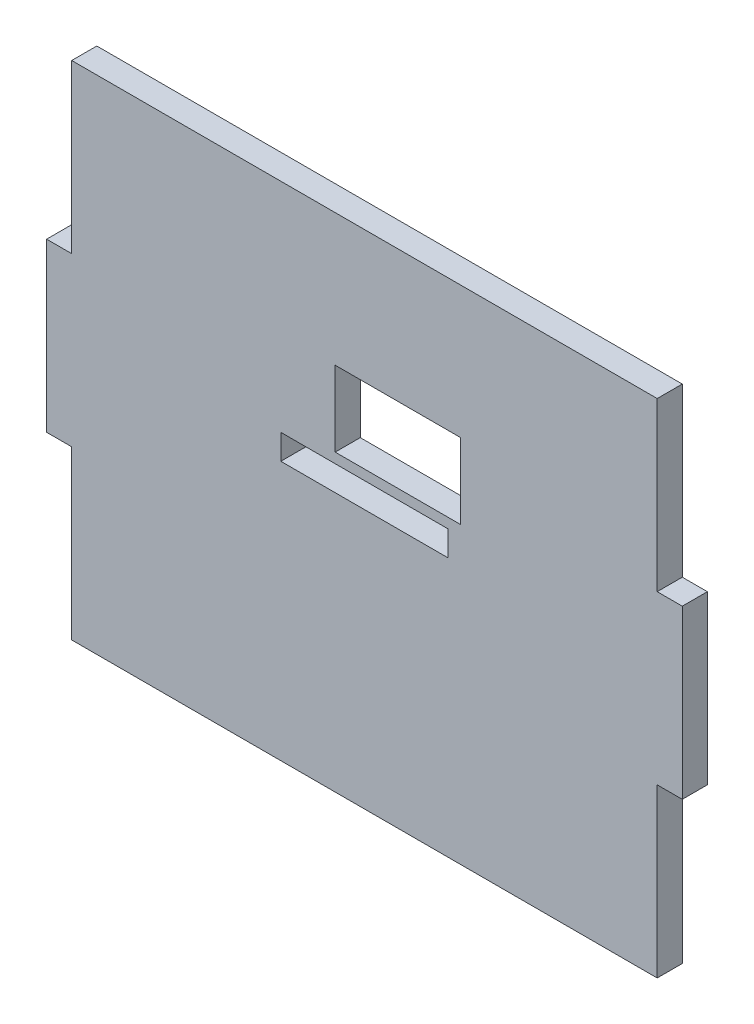
ISO-10303-21;
HEADER;
FILE_DESCRIPTION(('STEP AP214'),'2;1');
FILE_NAME('part.step','',(''),(''),'','','');
FILE_SCHEMA(('AUTOMOTIVE_DESIGN { 1 0 10303 214 1 1 1 1 }'));
ENDSEC;
DATA;
#1=APPLICATION_CONTEXT('core data for automotive mechanical design processes');
#2=APPLICATION_PROTOCOL_DEFINITION('international standard','automotive_design',2000,#1);
#3=PRODUCT_CONTEXT('',#1,'mechanical');
#4=PRODUCT('Part','Part','',(#3));
#5=PRODUCT_RELATED_PRODUCT_CATEGORY('part','',(#4));
#6=PRODUCT_DEFINITION_FORMATION('','',#4);
#7=PRODUCT_DEFINITION_CONTEXT('part definition',#1,'design');
#8=PRODUCT_DEFINITION('design','',#6,#7);
#9=PRODUCT_DEFINITION_SHAPE('','',#8);
#10=(LENGTH_UNIT() NAMED_UNIT(*) SI_UNIT(.MILLI.,.METRE.));
#11=(NAMED_UNIT(*) PLANE_ANGLE_UNIT() SI_UNIT($,.RADIAN.));
#12=(NAMED_UNIT(*) SI_UNIT($,.STERADIAN.) SOLID_ANGLE_UNIT());
#13=UNCERTAINTY_MEASURE_WITH_UNIT(LENGTH_MEASURE(1.E-05),#10,'distance_accuracy_value','');
#14=(GEOMETRIC_REPRESENTATION_CONTEXT(3) GLOBAL_UNCERTAINTY_ASSIGNED_CONTEXT((#13)) GLOBAL_UNIT_ASSIGNED_CONTEXT((#10,
#11,#12)) REPRESENTATION_CONTEXT('',''));
#15=CARTESIAN_POINT('',(0.,0.,0.));
#16=DIRECTION('',(0.,0.,1.));
#17=DIRECTION('',(1.,0.,0.));
#18=AXIS2_PLACEMENT_3D('',#15,#16,#17);
#19=CARTESIAN_POINT('',(-35.,30.,3.));
#20=DIRECTION('',(1.,0.,0.));
#21=DIRECTION('',(0.,1.,0.));
#22=AXIS2_PLACEMENT_3D('',#19,#20,#21);
#23=PLANE('',#22);
#24=DIRECTION('',(0.,0.,1.));
#25=VECTOR('',#24,1.);
#26=CARTESIAN_POINT('',(-35.,-10.,-20.2237484161567));
#27=LINE('',#26,#25);
#28=CARTESIAN_POINT('',(-35.,-10.,0.));
#29=VERTEX_POINT('',#28);
#30=CARTESIAN_POINT('',(-35.,-10.,3.));
#31=VERTEX_POINT('',#30);
#32=EDGE_CURVE('E58',#29,#31,#27,.T.);
#33=ORIENTED_EDGE('',*,*,#32,.F.);
#34=DIRECTION('',(0.,-1.,0.));
#35=VECTOR('',#34,1.);
#36=CARTESIAN_POINT('',(-35.,30.,0.));
#37=LINE('',#36,#35);
#38=CARTESIAN_POINT('',(-35.,-30.,0.));
#39=VERTEX_POINT('',#38);
#40=EDGE_CURVE('E254',#29,#39,#37,.T.);
#41=ORIENTED_EDGE('',*,*,#40,.T.);
#42=DIRECTION('',(0.,0.,-1.));
#43=VECTOR('',#42,1.);
#44=CARTESIAN_POINT('',(-35.,-30.,3.));
#45=LINE('',#44,#43);
#46=CARTESIAN_POINT('',(-35.,-30.,3.));
#47=VERTEX_POINT('',#46);
#48=EDGE_CURVE('E244',#47,#39,#45,.T.);
#49=ORIENTED_EDGE('',*,*,#48,.F.);
#50=DIRECTION('',(0.,-1.,0.));
#51=VECTOR('',#50,1.);
#52=CARTESIAN_POINT('',(-35.,30.,3.));
#53=LINE('',#52,#51);
#54=EDGE_CURVE('E217',#31,#47,#53,.T.);
#55=ORIENTED_EDGE('',*,*,#54,.F.);
#56=EDGE_LOOP('',(#33,#41,#49,#55));
#57=FACE_BOUND('',#56,.T.);
#58=ADVANCED_FACE('F33',(#57),#23,.F.);
#59=CARTESIAN_POINT('',(35.,30.,3.));
#60=DIRECTION('',(-1.,0.,0.));
#61=DIRECTION('',(0.,-1.,0.));
#62=AXIS2_PLACEMENT_3D('',#59,#60,#61);
#63=PLANE('',#62);
#64=DIRECTION('',(0.,0.,1.));
#65=VECTOR('',#64,1.);
#66=CARTESIAN_POINT('',(35.,10.,-20.2237484161567));
#67=LINE('',#66,#65);
#68=CARTESIAN_POINT('',(35.,10.,0.));
#69=VERTEX_POINT('',#68);
#70=CARTESIAN_POINT('',(35.,10.,3.));
#71=VERTEX_POINT('',#70);
#72=EDGE_CURVE('E357',#69,#71,#67,.T.);
#73=ORIENTED_EDGE('',*,*,#72,.F.);
#74=DIRECTION('',(0.,1.,0.));
#75=VECTOR('',#74,1.);
#76=CARTESIAN_POINT('',(35.,30.,0.));
#77=LINE('',#76,#75);
#78=CARTESIAN_POINT('',(35.,30.,0.));
#79=VERTEX_POINT('',#78);
#80=EDGE_CURVE('E237',#69,#79,#77,.T.);
#81=ORIENTED_EDGE('',*,*,#80,.T.);
#82=DIRECTION('',(0.,0.,-1.));
#83=VECTOR('',#82,1.);
#84=CARTESIAN_POINT('',(35.,30.,3.));
#85=LINE('',#84,#83);
#86=CARTESIAN_POINT('',(35.,30.,3.));
#87=VERTEX_POINT('',#86);
#88=EDGE_CURVE('E11',#87,#79,#85,.T.);
#89=ORIENTED_EDGE('',*,*,#88,.F.);
#90=DIRECTION('',(0.,1.,0.));
#91=VECTOR('',#90,1.);
#92=CARTESIAN_POINT('',(35.,30.,3.));
#93=LINE('',#92,#91);
#94=EDGE_CURVE('E250',#71,#87,#93,.T.);
#95=ORIENTED_EDGE('',*,*,#94,.F.);
#96=EDGE_LOOP('',(#73,#81,#89,#95));
#97=FACE_BOUND('',#96,.T.);
#98=ADVANCED_FACE('F354',(#97),#63,.F.);
#99=CARTESIAN_POINT('',(35.,-30.,0.));
#100=VERTEX_POINT('',#99);
#101=CARTESIAN_POINT('',(35.,-10.,0.));
#102=VERTEX_POINT('',#101);
#103=EDGE_CURVE('E240',#100,#102,#77,.T.);
#104=ORIENTED_EDGE('',*,*,#103,.T.);
#105=DIRECTION('',(0.,0.,1.));
#106=VECTOR('',#105,1.);
#107=CARTESIAN_POINT('',(35.,-10.,-20.2237484161567));
#108=LINE('',#107,#106);
#109=CARTESIAN_POINT('',(35.,-10.,3.));
#110=VERTEX_POINT('',#109);
#111=EDGE_CURVE('E262',#102,#110,#108,.T.);
#112=ORIENTED_EDGE('',*,*,#111,.T.);
#113=CARTESIAN_POINT('',(35.,-30.,3.));
#114=VERTEX_POINT('',#113);
#115=EDGE_CURVE('E341',#114,#110,#93,.T.);
#116=ORIENTED_EDGE('',*,*,#115,.F.);
#117=DIRECTION('',(0.,0.,-1.));
#118=VECTOR('',#117,1.);
#119=CARTESIAN_POINT('',(35.,-30.,3.));
#120=LINE('',#119,#118);
#121=EDGE_CURVE('E230',#114,#100,#120,.T.);
#122=ORIENTED_EDGE('',*,*,#121,.T.);
#123=EDGE_LOOP('',(#104,#112,#116,#122));
#124=FACE_BOUND('',#123,.T.);
#125=ADVANCED_FACE('F35',(#124),#63,.F.);
#126=CARTESIAN_POINT('',(-35.,30.,3.));
#127=DIRECTION('',(0.,-1.,0.));
#128=DIRECTION('',(0.,0.,-1.));
#129=AXIS2_PLACEMENT_3D('',#126,#127,#128);
#130=PLANE('',#129);
#131=DIRECTION('',(-1.,0.,0.));
#132=VECTOR('',#131,1.);
#133=CARTESIAN_POINT('',(-35.,30.,0.));
#134=LINE('',#133,#132);
#135=CARTESIAN_POINT('',(-35.,30.,0.));
#136=VERTEX_POINT('',#135);
#137=EDGE_CURVE('E233',#79,#136,#134,.T.);
#138=ORIENTED_EDGE('',*,*,#137,.T.);
#139=DIRECTION('',(0.,0.,-1.));
#140=VECTOR('',#139,1.);
#141=CARTESIAN_POINT('',(-35.,30.,3.));
#142=LINE('',#141,#140);
#143=CARTESIAN_POINT('',(-35.,30.,3.));
#144=VERTEX_POINT('',#143);
#145=EDGE_CURVE('E42',#144,#136,#142,.T.);
#146=ORIENTED_EDGE('',*,*,#145,.F.);
#147=DIRECTION('',(-1.,0.,0.));
#148=VECTOR('',#147,1.);
#149=CARTESIAN_POINT('',(-35.,30.,3.));
#150=LINE('',#149,#148);
#151=EDGE_CURVE('E221',#87,#144,#150,.T.);
#152=ORIENTED_EDGE('',*,*,#151,.F.);
#153=ORIENTED_EDGE('',*,*,#88,.T.);
#154=EDGE_LOOP('',(#138,#146,#152,#153));
#155=FACE_BOUND('',#154,.T.);
#156=ADVANCED_FACE('F353',(#155),#130,.F.);
#157=CARTESIAN_POINT('',(-35.,9.99999999999999,0.));
#158=VERTEX_POINT('',#157);
#159=EDGE_CURVE('E251',#136,#158,#37,.T.);
#160=ORIENTED_EDGE('',*,*,#159,.T.);
#161=DIRECTION('',(0.,0.,1.));
#162=VECTOR('',#161,1.);
#163=CARTESIAN_POINT('',(-35.,10.,-20.2237484161567));
#164=LINE('',#163,#162);
#165=CARTESIAN_POINT('',(-35.,9.99999999999999,3.));
#166=VERTEX_POINT('',#165);
#167=EDGE_CURVE('E50',#158,#166,#164,.T.);
#168=ORIENTED_EDGE('',*,*,#167,.T.);
#169=EDGE_CURVE('E220',#144,#166,#53,.T.);
#170=ORIENTED_EDGE('',*,*,#169,.F.);
#171=ORIENTED_EDGE('',*,*,#145,.T.);
#172=EDGE_LOOP('',(#160,#168,#170,#171));
#173=FACE_BOUND('',#172,.T.);
#174=ADVANCED_FACE('F407',(#173),#23,.F.);
#175=CARTESIAN_POINT('',(-35.,-30.,3.));
#176=DIRECTION('',(0.,1.,0.));
#177=DIRECTION('',(0.,0.,1.));
#178=AXIS2_PLACEMENT_3D('',#175,#176,#177);
#179=PLANE('',#178);
#180=DIRECTION('',(1.,0.,0.));
#181=VECTOR('',#180,1.);
#182=CARTESIAN_POINT('',(-35.,-30.,0.));
#183=LINE('',#182,#181);
#184=EDGE_CURVE('E249',#39,#100,#183,.T.);
#185=ORIENTED_EDGE('',*,*,#184,.T.);
#186=ORIENTED_EDGE('',*,*,#121,.F.);
#187=DIRECTION('',(1.,0.,0.));
#188=VECTOR('',#187,1.);
#189=CARTESIAN_POINT('',(-35.,-30.,3.));
#190=LINE('',#189,#188);
#191=EDGE_CURVE('E227',#47,#114,#190,.T.);
#192=ORIENTED_EDGE('',*,*,#191,.F.);
#193=ORIENTED_EDGE('',*,*,#48,.T.);
#194=EDGE_LOOP('',(#185,#186,#192,#193));
#195=FACE_BOUND('',#194,.T.);
#196=ADVANCED_FACE('F367',(#195),#179,.F.);
#197=CARTESIAN_POINT('',(0.,0.,3.));
#198=DIRECTION('',(0.,0.,1.));
#199=DIRECTION('',(1.,0.,0.));
#200=AXIS2_PLACEMENT_3D('',#197,#198,#199);
#201=PLANE('',#200);
#202=DIRECTION('',(0.,-1.,0.));
#203=VECTOR('',#202,1.);
#204=CARTESIAN_POINT('',(-10.,4.,3.));
#205=LINE('',#204,#203);
#206=CARTESIAN_POINT('',(-10.,4.,3.));
#207=VERTEX_POINT('',#206);
#208=CARTESIAN_POINT('',(-10.,0.999999999999997,3.));
#209=VERTEX_POINT('',#208);
#210=EDGE_CURVE('E287',#207,#209,#205,.T.);
#211=ORIENTED_EDGE('',*,*,#210,.F.);
#212=DIRECTION('',(-1.,0.,0.));
#213=VECTOR('',#212,1.);
#214=CARTESIAN_POINT('',(10.,4.,3.));
#215=LINE('',#214,#213);
#216=CARTESIAN_POINT('',(10.,4.,3.));
#217=VERTEX_POINT('',#216);
#218=EDGE_CURVE('E277',#217,#207,#215,.T.);
#219=ORIENTED_EDGE('',*,*,#218,.F.);
#220=DIRECTION('',(0.,1.,0.));
#221=VECTOR('',#220,1.);
#222=CARTESIAN_POINT('',(10.,4.,3.));
#223=LINE('',#222,#221);
#224=CARTESIAN_POINT('',(10.,0.999999999999999,3.));
#225=VERTEX_POINT('',#224);
#226=EDGE_CURVE('E293',#225,#217,#223,.T.);
#227=ORIENTED_EDGE('',*,*,#226,.F.);
#228=DIRECTION('',(1.,0.,0.));
#229=VECTOR('',#228,1.);
#230=CARTESIAN_POINT('',(10.,0.999999999999999,3.));
#231=LINE('',#230,#229);
#232=EDGE_CURVE('E289',#209,#225,#231,.T.);
#233=ORIENTED_EDGE('',*,*,#232,.F.);
#234=EDGE_LOOP('',(#211,#219,#227,#233));
#235=FACE_BOUND('',#234,.T.);
#236=DIRECTION('',(0.,1.,0.));
#237=VECTOR('',#236,1.);
#238=CARTESIAN_POINT('',(11.5,14.2,3.));
#239=LINE('',#238,#237);
#240=CARTESIAN_POINT('',(11.5,5.20000000000002,3.));
#241=VERTEX_POINT('',#240);
#242=CARTESIAN_POINT('',(11.5,14.2,3.));
#243=VERTEX_POINT('',#242);
#244=EDGE_CURVE('E300',#241,#243,#239,.T.);
#245=ORIENTED_EDGE('',*,*,#244,.F.);
#246=DIRECTION('',(1.,0.,0.));
#247=VECTOR('',#246,1.);
#248=CARTESIAN_POINT('',(-3.5,5.20000000000002,3.));
#249=LINE('',#248,#247);
#250=CARTESIAN_POINT('',(-3.5,5.20000000000002,3.));
#251=VERTEX_POINT('',#250);
#252=EDGE_CURVE('E311',#251,#241,#249,.T.);
#253=ORIENTED_EDGE('',*,*,#252,.F.);
#254=DIRECTION('',(0.,-1.,0.));
#255=VECTOR('',#254,1.);
#256=CARTESIAN_POINT('',(-3.5,14.2,3.));
#257=LINE('',#256,#255);
#258=CARTESIAN_POINT('',(-3.5,14.2,3.));
#259=VERTEX_POINT('',#258);
#260=EDGE_CURVE('E325',#259,#251,#257,.T.);
#261=ORIENTED_EDGE('',*,*,#260,.F.);
#262=DIRECTION('',(-1.,0.,0.));
#263=VECTOR('',#262,1.);
#264=CARTESIAN_POINT('',(-3.5,14.2,3.));
#265=LINE('',#264,#263);
#266=EDGE_CURVE('E322',#243,#259,#265,.T.);
#267=ORIENTED_EDGE('',*,*,#266,.F.);
#268=EDGE_LOOP('',(#245,#253,#261,#267));
#269=FACE_BOUND('',#268,.T.);
#270=ORIENTED_EDGE('',*,*,#115,.T.);
#271=DIRECTION('',(1.,0.,0.));
#272=VECTOR('',#271,1.);
#273=CARTESIAN_POINT('',(38.,-10.,3.));
#274=LINE('',#273,#272);
#275=CARTESIAN_POINT('',(38.,-10.,3.));
#276=VERTEX_POINT('',#275);
#277=EDGE_CURVE('E213',#110,#276,#274,.T.);
#278=ORIENTED_EDGE('',*,*,#277,.T.);
#279=DIRECTION('',(0.,1.,0.));
#280=VECTOR('',#279,1.);
#281=CARTESIAN_POINT('',(38.,10.,3.));
#282=LINE('',#281,#280);
#283=CARTESIAN_POINT('',(38.,10.,3.));
#284=VERTEX_POINT('',#283);
#285=EDGE_CURVE('E261',#276,#284,#282,.T.);
#286=ORIENTED_EDGE('',*,*,#285,.T.);
#287=DIRECTION('',(-1.,0.,0.));
#288=VECTOR('',#287,1.);
#289=CARTESIAN_POINT('',(38.,10.,3.));
#290=LINE('',#289,#288);
#291=EDGE_CURVE('E266',#284,#71,#290,.T.);
#292=ORIENTED_EDGE('',*,*,#291,.T.);
#293=ORIENTED_EDGE('',*,*,#94,.T.);
#294=ORIENTED_EDGE('',*,*,#151,.T.);
#295=ORIENTED_EDGE('',*,*,#169,.T.);
#296=DIRECTION('',(-1.,0.,0.));
#297=VECTOR('',#296,1.);
#298=CARTESIAN_POINT('',(-35.,10.,3.));
#299=LINE('',#298,#297);
#300=CARTESIAN_POINT('',(-38.,9.99999999999999,3.));
#301=VERTEX_POINT('',#300);
#302=EDGE_CURVE('E184',#166,#301,#299,.T.);
#303=ORIENTED_EDGE('',*,*,#302,.T.);
#304=DIRECTION('',(0.,-1.,0.));
#305=VECTOR('',#304,1.);
#306=CARTESIAN_POINT('',(-38.,9.99999999999999,3.));
#307=LINE('',#306,#305);
#308=CARTESIAN_POINT('',(-38.,-10.,3.));
#309=VERTEX_POINT('',#308);
#310=EDGE_CURVE('E179',#301,#309,#307,.T.);
#311=ORIENTED_EDGE('',*,*,#310,.T.);
#312=DIRECTION('',(1.,0.,0.));
#313=VECTOR('',#312,1.);
#314=CARTESIAN_POINT('',(-35.,-10.,3.));
#315=LINE('',#314,#313);
#316=EDGE_CURVE('E187',#309,#31,#315,.T.);
#317=ORIENTED_EDGE('',*,*,#316,.T.);
#318=ORIENTED_EDGE('',*,*,#54,.T.);
#319=ORIENTED_EDGE('',*,*,#191,.T.);
#320=EDGE_LOOP('',(#270,#278,#286,#292,#293,#294,#295,#303,#311,#317,#318,#319));
#321=FACE_BOUND('',#320,.T.);
#322=ADVANCED_FACE('F192',(#235,#269,#321),#201,.T.);
#323=CARTESIAN_POINT('',(0.,0.,0.));
#324=DIRECTION('',(0.,0.,1.));
#325=DIRECTION('',(1.,0.,0.));
#326=AXIS2_PLACEMENT_3D('',#323,#324,#325);
#327=PLANE('',#326);
#328=DIRECTION('',(-1.,0.,0.));
#329=VECTOR('',#328,1.);
#330=CARTESIAN_POINT('',(10.,4.,0.));
#331=LINE('',#330,#329);
#332=CARTESIAN_POINT('',(10.,4.,0.));
#333=VERTEX_POINT('',#332);
#334=CARTESIAN_POINT('',(-10.,4.,0.));
#335=VERTEX_POINT('',#334);
#336=EDGE_CURVE('E283',#333,#335,#331,.T.);
#337=ORIENTED_EDGE('',*,*,#336,.T.);
#338=DIRECTION('',(0.,-1.,0.));
#339=VECTOR('',#338,1.);
#340=CARTESIAN_POINT('',(-10.,4.,0.));
#341=LINE('',#340,#339);
#342=CARTESIAN_POINT('',(-10.,0.999999999999997,0.));
#343=VERTEX_POINT('',#342);
#344=EDGE_CURVE('E273',#335,#343,#341,.T.);
#345=ORIENTED_EDGE('',*,*,#344,.T.);
#346=DIRECTION('',(1.,0.,0.));
#347=VECTOR('',#346,1.);
#348=CARTESIAN_POINT('',(10.,0.999999999999999,0.));
#349=LINE('',#348,#347);
#350=CARTESIAN_POINT('',(10.,1.,0.));
#351=VERTEX_POINT('',#350);
#352=EDGE_CURVE('E276',#343,#351,#349,.T.);
#353=ORIENTED_EDGE('',*,*,#352,.T.);
#354=DIRECTION('',(0.,1.,0.));
#355=VECTOR('',#354,1.);
#356=CARTESIAN_POINT('',(10.,4.,0.));
#357=LINE('',#356,#355);
#358=EDGE_CURVE('E280',#351,#333,#357,.T.);
#359=ORIENTED_EDGE('',*,*,#358,.T.);
#360=EDGE_LOOP('',(#337,#345,#353,#359));
#361=FACE_BOUND('',#360,.T.);
#362=DIRECTION('',(1.,0.,0.));
#363=VECTOR('',#362,1.);
#364=CARTESIAN_POINT('',(-3.5,5.20000000000002,0.));
#365=LINE('',#364,#363);
#366=CARTESIAN_POINT('',(-3.5,5.20000000000002,0.));
#367=VERTEX_POINT('',#366);
#368=CARTESIAN_POINT('',(11.5,5.20000000000002,0.));
#369=VERTEX_POINT('',#368);
#370=EDGE_CURVE('E317',#367,#369,#365,.T.);
#371=ORIENTED_EDGE('',*,*,#370,.T.);
#372=DIRECTION('',(0.,1.,0.));
#373=VECTOR('',#372,1.);
#374=CARTESIAN_POINT('',(11.5,14.2,0.));
#375=LINE('',#374,#373);
#376=CARTESIAN_POINT('',(11.5,14.2,0.));
#377=VERTEX_POINT('',#376);
#378=EDGE_CURVE('E307',#369,#377,#375,.T.);
#379=ORIENTED_EDGE('',*,*,#378,.T.);
#380=DIRECTION('',(-1.,0.,0.));
#381=VECTOR('',#380,1.);
#382=CARTESIAN_POINT('',(-3.5,14.2,0.));
#383=LINE('',#382,#381);
#384=CARTESIAN_POINT('',(-3.5,14.2,0.));
#385=VERTEX_POINT('',#384);
#386=EDGE_CURVE('E310',#377,#385,#383,.T.);
#387=ORIENTED_EDGE('',*,*,#386,.T.);
#388=DIRECTION('',(0.,-1.,0.));
#389=VECTOR('',#388,1.);
#390=CARTESIAN_POINT('',(-3.5,14.2,0.));
#391=LINE('',#390,#389);
#392=EDGE_CURVE('E314',#385,#367,#391,.T.);
#393=ORIENTED_EDGE('',*,*,#392,.T.);
#394=EDGE_LOOP('',(#371,#379,#387,#393));
#395=FACE_BOUND('',#394,.T.);
#396=ORIENTED_EDGE('',*,*,#103,.F.);
#397=ORIENTED_EDGE('',*,*,#184,.F.);
#398=ORIENTED_EDGE('',*,*,#40,.F.);
#399=DIRECTION('',(-1.,0.,0.));
#400=VECTOR('',#399,1.);
#401=CARTESIAN_POINT('',(-35.,-10.,0.));
#402=LINE('',#401,#400);
#403=CARTESIAN_POINT('',(-38.,-10.,0.));
#404=VERTEX_POINT('',#403);
#405=EDGE_CURVE('E211',#29,#404,#402,.T.);
#406=ORIENTED_EDGE('',*,*,#405,.T.);
#407=DIRECTION('',(0.,1.,0.));
#408=VECTOR('',#407,1.);
#409=CARTESIAN_POINT('',(-38.,9.99999999999999,0.));
#410=LINE('',#409,#408);
#411=CARTESIAN_POINT('',(-38.,9.99999999999999,0.));
#412=VERTEX_POINT('',#411);
#413=EDGE_CURVE('E181',#404,#412,#410,.T.);
#414=ORIENTED_EDGE('',*,*,#413,.T.);
#415=DIRECTION('',(1.,0.,0.));
#416=VECTOR('',#415,1.);
#417=CARTESIAN_POINT('',(-35.,10.,0.));
#418=LINE('',#417,#416);
#419=EDGE_CURVE('E199',#412,#158,#418,.T.);
#420=ORIENTED_EDGE('',*,*,#419,.T.);
#421=ORIENTED_EDGE('',*,*,#159,.F.);
#422=ORIENTED_EDGE('',*,*,#137,.F.);
#423=ORIENTED_EDGE('',*,*,#80,.F.);
#424=DIRECTION('',(1.,0.,0.));
#425=VECTOR('',#424,1.);
#426=CARTESIAN_POINT('',(38.,10.,0.));
#427=LINE('',#426,#425);
#428=CARTESIAN_POINT('',(38.,10.,0.));
#429=VERTEX_POINT('',#428);
#430=EDGE_CURVE('E388',#69,#429,#427,.T.);
#431=ORIENTED_EDGE('',*,*,#430,.T.);
#432=DIRECTION('',(0.,-1.,0.));
#433=VECTOR('',#432,1.);
#434=CARTESIAN_POINT('',(38.,10.,0.));
#435=LINE('',#434,#433);
#436=CARTESIAN_POINT('',(38.,-10.,0.));
#437=VERTEX_POINT('',#436);
#438=EDGE_CURVE('E390',#429,#437,#435,.T.);
#439=ORIENTED_EDGE('',*,*,#438,.T.);
#440=DIRECTION('',(-1.,0.,0.));
#441=VECTOR('',#440,1.);
#442=CARTESIAN_POINT('',(38.,-10.,0.));
#443=LINE('',#442,#441);
#444=EDGE_CURVE('E290',#437,#102,#443,.T.);
#445=ORIENTED_EDGE('',*,*,#444,.T.);
#446=EDGE_LOOP('',(#396,#397,#398,#406,#414,#420,#421,#422,#423,#431,#439,#445));
#447=FACE_BOUND('',#446,.T.);
#448=ADVANCED_FACE('F362',(#361,#395,#447),#327,.F.);
#449=CARTESIAN_POINT('',(11.5,14.2,0.));
#450=DIRECTION('',(1.,0.,0.));
#451=DIRECTION('',(0.,0.,-1.));
#452=AXIS2_PLACEMENT_3D('',#449,#450,#451);
#453=PLANE('',#452);
#454=ORIENTED_EDGE('',*,*,#244,.T.);
#455=DIRECTION('',(0.,0.,1.));
#456=VECTOR('',#455,1.);
#457=CARTESIAN_POINT('',(11.5,14.2,0.));
#458=LINE('',#457,#456);
#459=EDGE_CURVE('E320',#377,#243,#458,.T.);
#460=ORIENTED_EDGE('',*,*,#459,.F.);
#461=ORIENTED_EDGE('',*,*,#378,.F.);
#462=DIRECTION('',(0.,0.,1.));
#463=VECTOR('',#462,1.);
#464=CARTESIAN_POINT('',(11.5,5.20000000000002,0.));
#465=LINE('',#464,#463);
#466=EDGE_CURVE('E330',#369,#241,#465,.T.);
#467=ORIENTED_EDGE('',*,*,#466,.T.);
#468=EDGE_LOOP('',(#454,#460,#461,#467));
#469=FACE_BOUND('',#468,.T.);
#470=ADVANCED_FACE('F455',(#469),#453,.F.);
#471=CARTESIAN_POINT('',(-3.5,5.20000000000002,0.));
#472=DIRECTION('',(0.,-1.,0.));
#473=DIRECTION('',(0.,0.,-1.));
#474=AXIS2_PLACEMENT_3D('',#471,#472,#473);
#475=PLANE('',#474);
#476=ORIENTED_EDGE('',*,*,#252,.T.);
#477=ORIENTED_EDGE('',*,*,#466,.F.);
#478=ORIENTED_EDGE('',*,*,#370,.F.);
#479=DIRECTION('',(0.,0.,1.));
#480=VECTOR('',#479,1.);
#481=CARTESIAN_POINT('',(-3.5,5.20000000000002,0.));
#482=LINE('',#481,#480);
#483=EDGE_CURVE('E332',#367,#251,#482,.T.);
#484=ORIENTED_EDGE('',*,*,#483,.T.);
#485=EDGE_LOOP('',(#476,#477,#478,#484));
#486=FACE_BOUND('',#485,.T.);
#487=ADVANCED_FACE('F523',(#486),#475,.F.);
#488=CARTESIAN_POINT('',(-3.5,14.2,0.));
#489=DIRECTION('',(-1.,0.,0.));
#490=DIRECTION('',(0.,-1.,0.));
#491=AXIS2_PLACEMENT_3D('',#488,#489,#490);
#492=PLANE('',#491);
#493=ORIENTED_EDGE('',*,*,#260,.T.);
#494=ORIENTED_EDGE('',*,*,#483,.F.);
#495=ORIENTED_EDGE('',*,*,#392,.F.);
#496=DIRECTION('',(0.,0.,1.));
#497=VECTOR('',#496,1.);
#498=CARTESIAN_POINT('',(-3.5,14.2,0.));
#499=LINE('',#498,#497);
#500=EDGE_CURVE('E334',#385,#259,#499,.T.);
#501=ORIENTED_EDGE('',*,*,#500,.T.);
#502=EDGE_LOOP('',(#493,#494,#495,#501));
#503=FACE_BOUND('',#502,.T.);
#504=ADVANCED_FACE('F515',(#503),#492,.F.);
#505=CARTESIAN_POINT('',(-3.5,14.2,0.));
#506=DIRECTION('',(0.,1.,0.));
#507=DIRECTION('',(0.,0.,1.));
#508=AXIS2_PLACEMENT_3D('',#505,#506,#507);
#509=PLANE('',#508);
#510=ORIENTED_EDGE('',*,*,#266,.T.);
#511=ORIENTED_EDGE('',*,*,#500,.F.);
#512=ORIENTED_EDGE('',*,*,#386,.F.);
#513=ORIENTED_EDGE('',*,*,#459,.T.);
#514=EDGE_LOOP('',(#510,#511,#512,#513));
#515=FACE_BOUND('',#514,.T.);
#516=ADVANCED_FACE('F507',(#515),#509,.F.);
#517=CARTESIAN_POINT('',(-10.,4.,0.));
#518=DIRECTION('',(-1.,0.,0.));
#519=DIRECTION('',(0.,0.,1.));
#520=AXIS2_PLACEMENT_3D('',#517,#518,#519);
#521=PLANE('',#520);
#522=ORIENTED_EDGE('',*,*,#210,.T.);
#523=DIRECTION('',(0.,0.,1.));
#524=VECTOR('',#523,1.);
#525=CARTESIAN_POINT('',(-10.,0.999999999999997,0.));
#526=LINE('',#525,#524);
#527=EDGE_CURVE('E286',#343,#209,#526,.T.);
#528=ORIENTED_EDGE('',*,*,#527,.F.);
#529=ORIENTED_EDGE('',*,*,#344,.F.);
#530=DIRECTION('',(0.,0.,1.));
#531=VECTOR('',#530,1.);
#532=CARTESIAN_POINT('',(-10.,4.,0.));
#533=LINE('',#532,#531);
#534=EDGE_CURVE('E298',#335,#207,#533,.T.);
#535=ORIENTED_EDGE('',*,*,#534,.T.);
#536=EDGE_LOOP('',(#522,#528,#529,#535));
#537=FACE_BOUND('',#536,.T.);
#538=ADVANCED_FACE('F499',(#537),#521,.F.);
#539=CARTESIAN_POINT('',(10.,4.,0.));
#540=DIRECTION('',(0.,1.,0.));
#541=DIRECTION('',(-1.,0.,0.));
#542=AXIS2_PLACEMENT_3D('',#539,#540,#541);
#543=PLANE('',#542);
#544=ORIENTED_EDGE('',*,*,#218,.T.);
#545=ORIENTED_EDGE('',*,*,#534,.F.);
#546=ORIENTED_EDGE('',*,*,#336,.F.);
#547=DIRECTION('',(0.,0.,1.));
#548=VECTOR('',#547,1.);
#549=CARTESIAN_POINT('',(10.,4.,0.));
#550=LINE('',#549,#548);
#551=EDGE_CURVE('E301',#333,#217,#550,.T.);
#552=ORIENTED_EDGE('',*,*,#551,.T.);
#553=EDGE_LOOP('',(#544,#545,#546,#552));
#554=FACE_BOUND('',#553,.T.);
#555=ADVANCED_FACE('F491',(#554),#543,.F.);
#556=CARTESIAN_POINT('',(10.,4.,0.));
#557=DIRECTION('',(1.,0.,0.));
#558=DIRECTION('',(0.,0.,-1.));
#559=AXIS2_PLACEMENT_3D('',#556,#557,#558);
#560=PLANE('',#559);
#561=ORIENTED_EDGE('',*,*,#226,.T.);
#562=ORIENTED_EDGE('',*,*,#551,.F.);
#563=ORIENTED_EDGE('',*,*,#358,.F.);
#564=DIRECTION('',(0.,0.,1.));
#565=VECTOR('',#564,1.);
#566=CARTESIAN_POINT('',(10.,0.999999999999999,0.));
#567=LINE('',#566,#565);
#568=EDGE_CURVE('E303',#351,#225,#567,.T.);
#569=ORIENTED_EDGE('',*,*,#568,.T.);
#570=EDGE_LOOP('',(#561,#562,#563,#569));
#571=FACE_BOUND('',#570,.T.);
#572=ADVANCED_FACE('F484',(#571),#560,.F.);
#573=CARTESIAN_POINT('',(10.,0.999999999999999,0.));
#574=DIRECTION('',(0.,-1.,0.));
#575=DIRECTION('',(1.,0.,0.));
#576=AXIS2_PLACEMENT_3D('',#573,#574,#575);
#577=PLANE('',#576);
#578=ORIENTED_EDGE('',*,*,#232,.T.);
#579=ORIENTED_EDGE('',*,*,#568,.F.);
#580=ORIENTED_EDGE('',*,*,#352,.F.);
#581=ORIENTED_EDGE('',*,*,#527,.T.);
#582=EDGE_LOOP('',(#578,#579,#580,#581));
#583=FACE_BOUND('',#582,.T.);
#584=ADVANCED_FACE('F403',(#583),#577,.F.);
#585=CARTESIAN_POINT('',(38.,10.,-20.2237484161567));
#586=DIRECTION('',(0.,1.,0.));
#587=DIRECTION('',(-1.,0.,0.));
#588=AXIS2_PLACEMENT_3D('',#585,#586,#587);
#589=PLANE('',#588);
#590=ORIENTED_EDGE('',*,*,#430,.F.);
#591=ORIENTED_EDGE('',*,*,#72,.T.);
#592=ORIENTED_EDGE('',*,*,#291,.F.);
#593=DIRECTION('',(0.,0.,1.));
#594=VECTOR('',#593,1.);
#595=CARTESIAN_POINT('',(38.,10.,-20.2237484161567));
#596=LINE('',#595,#594);
#597=EDGE_CURVE('E382',#429,#284,#596,.T.);
#598=ORIENTED_EDGE('',*,*,#597,.F.);
#599=EDGE_LOOP('',(#590,#591,#592,#598));
#600=FACE_BOUND('',#599,.T.);
#601=ADVANCED_FACE('F381',(#600),#589,.T.);
#602=CARTESIAN_POINT('',(38.,10.,-20.2237484161567));
#603=DIRECTION('',(1.,0.,0.));
#604=DIRECTION('',(0.,0.,-1.));
#605=AXIS2_PLACEMENT_3D('',#602,#603,#604);
#606=PLANE('',#605);
#607=ORIENTED_EDGE('',*,*,#438,.F.);
#608=ORIENTED_EDGE('',*,*,#597,.T.);
#609=ORIENTED_EDGE('',*,*,#285,.F.);
#610=DIRECTION('',(0.,0.,1.));
#611=VECTOR('',#610,1.);
#612=CARTESIAN_POINT('',(38.,-10.,-20.2237484161567));
#613=LINE('',#612,#611);
#614=EDGE_CURVE('E265',#437,#276,#613,.T.);
#615=ORIENTED_EDGE('',*,*,#614,.F.);
#616=EDGE_LOOP('',(#607,#608,#609,#615));
#617=FACE_BOUND('',#616,.T.);
#618=ADVANCED_FACE('F395',(#617),#606,.T.);
#619=CARTESIAN_POINT('',(38.,-10.,-20.2237484161567));
#620=DIRECTION('',(0.,-1.,0.));
#621=DIRECTION('',(1.,0.,0.));
#622=AXIS2_PLACEMENT_3D('',#619,#620,#621);
#623=PLANE('',#622);
#624=ORIENTED_EDGE('',*,*,#444,.F.);
#625=ORIENTED_EDGE('',*,*,#614,.T.);
#626=ORIENTED_EDGE('',*,*,#277,.F.);
#627=ORIENTED_EDGE('',*,*,#111,.F.);
#628=EDGE_LOOP('',(#624,#625,#626,#627));
#629=FACE_BOUND('',#628,.T.);
#630=ADVANCED_FACE('F374',(#629),#623,.T.);
#631=CARTESIAN_POINT('',(-38.,9.99999999999999,-20.2237484161567));
#632=DIRECTION('',(-1.,0.,0.));
#633=DIRECTION('',(0.,0.,1.));
#634=AXIS2_PLACEMENT_3D('',#631,#632,#633);
#635=PLANE('',#634);
#636=ORIENTED_EDGE('',*,*,#413,.F.);
#637=DIRECTION('',(0.,0.,1.));
#638=VECTOR('',#637,1.);
#639=CARTESIAN_POINT('',(-38.,-10.,-20.2237484161567));
#640=LINE('',#639,#638);
#641=EDGE_CURVE('E174',#404,#309,#640,.T.);
#642=ORIENTED_EDGE('',*,*,#641,.T.);
#643=ORIENTED_EDGE('',*,*,#310,.F.);
#644=DIRECTION('',(0.,0.,1.));
#645=VECTOR('',#644,1.);
#646=CARTESIAN_POINT('',(-38.,9.99999999999999,-20.2237484161567));
#647=LINE('',#646,#645);
#648=EDGE_CURVE('E197',#412,#301,#647,.T.);
#649=ORIENTED_EDGE('',*,*,#648,.F.);
#650=EDGE_LOOP('',(#636,#642,#643,#649));
#651=FACE_BOUND('',#650,.T.);
#652=ADVANCED_FACE('F176',(#651),#635,.T.);
#653=CARTESIAN_POINT('',(-35.,10.,-20.2237484161567));
#654=DIRECTION('',(0.,1.,0.));
#655=DIRECTION('',(-1.,0.,0.));
#656=AXIS2_PLACEMENT_3D('',#653,#654,#655);
#657=PLANE('',#656);
#658=ORIENTED_EDGE('',*,*,#419,.F.);
#659=ORIENTED_EDGE('',*,*,#648,.T.);
#660=ORIENTED_EDGE('',*,*,#302,.F.);
#661=ORIENTED_EDGE('',*,*,#167,.F.);
#662=EDGE_LOOP('',(#658,#659,#660,#661));
#663=FACE_BOUND('',#662,.T.);
#664=ADVANCED_FACE('F422',(#663),#657,.T.);
#665=CARTESIAN_POINT('',(-35.,-10.,-20.2237484161567));
#666=DIRECTION('',(0.,-1.,0.));
#667=DIRECTION('',(0.,0.,-1.));
#668=AXIS2_PLACEMENT_3D('',#665,#666,#667);
#669=PLANE('',#668);
#670=ORIENTED_EDGE('',*,*,#405,.F.);
#671=ORIENTED_EDGE('',*,*,#32,.T.);
#672=ORIENTED_EDGE('',*,*,#316,.F.);
#673=ORIENTED_EDGE('',*,*,#641,.F.);
#674=EDGE_LOOP('',(#670,#671,#672,#673));
#675=FACE_BOUND('',#674,.T.);
#676=ADVANCED_FACE('F188',(#675),#669,.T.);
#677=CLOSED_SHELL('',(#58,#98,#125,#156,#174,#196,#322,#448,#470,#487,#504,#516,#538,#555,#572,
#584,#601,#618,#630,#652,#664,#676));
#678=MANIFOLD_SOLID_BREP('B2',#677);
#679=ADVANCED_BREP_SHAPE_REPRESENTATION('',(#18,#678),#14);
#680=SHAPE_DEFINITION_REPRESENTATION(#9,#679);
ENDSEC;
END-ISO-10303-21;
